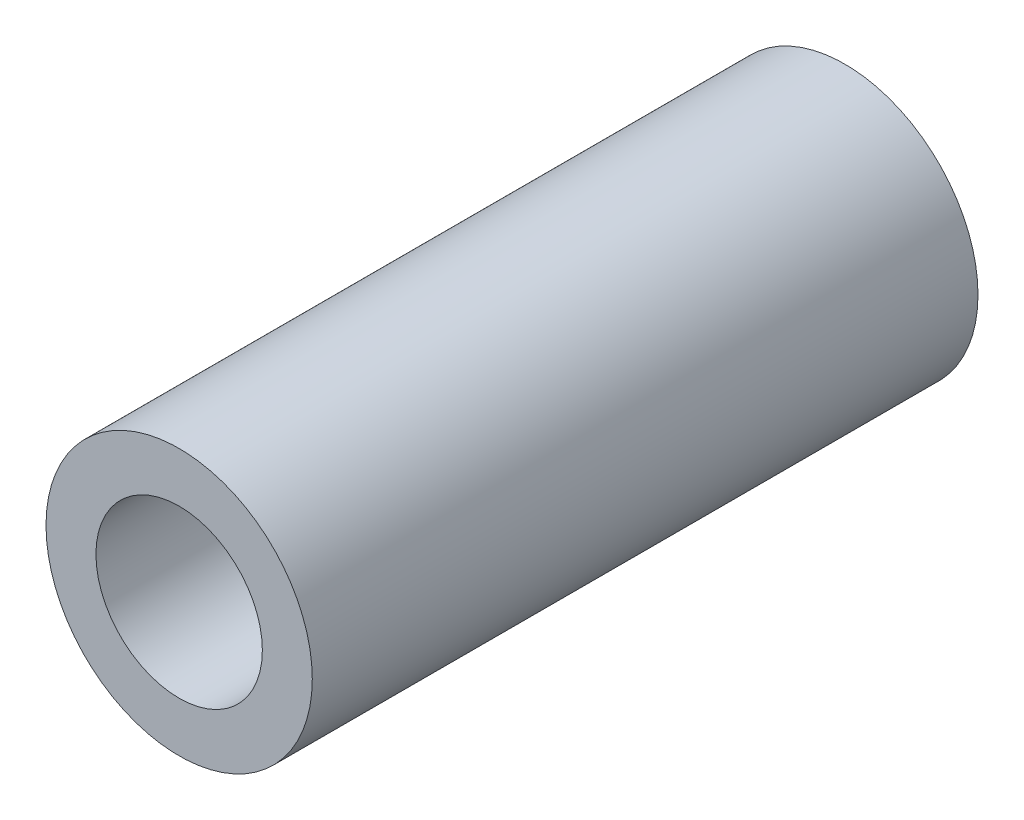
ISO-10303-21;
HEADER;
FILE_DESCRIPTION(('STEP AP214'),'2;1');
FILE_NAME('part.step','',(''),(''),'','','');
FILE_SCHEMA(('AUTOMOTIVE_DESIGN { 1 0 10303 214 1 1 1 1 }'));
ENDSEC;
DATA;
#1=APPLICATION_CONTEXT('core data for automotive mechanical design processes');
#2=APPLICATION_PROTOCOL_DEFINITION('international standard','automotive_design',2000,#1);
#3=PRODUCT_CONTEXT('',#1,'mechanical');
#4=PRODUCT('Part','Part','',(#3));
#5=PRODUCT_RELATED_PRODUCT_CATEGORY('part','',(#4));
#6=PRODUCT_DEFINITION_FORMATION('','',#4);
#7=PRODUCT_DEFINITION_CONTEXT('part definition',#1,'design');
#8=PRODUCT_DEFINITION('design','',#6,#7);
#9=PRODUCT_DEFINITION_SHAPE('','',#8);
#10=(LENGTH_UNIT() NAMED_UNIT(*) SI_UNIT(.MILLI.,.METRE.));
#11=(NAMED_UNIT(*) PLANE_ANGLE_UNIT() SI_UNIT($,.RADIAN.));
#12=(NAMED_UNIT(*) SI_UNIT($,.STERADIAN.) SOLID_ANGLE_UNIT());
#13=UNCERTAINTY_MEASURE_WITH_UNIT(LENGTH_MEASURE(1.E-05),#10,'distance_accuracy_value','');
#14=(GEOMETRIC_REPRESENTATION_CONTEXT(3) GLOBAL_UNCERTAINTY_ASSIGNED_CONTEXT((#13)) GLOBAL_UNIT_ASSIGNED_CONTEXT((#10,
#11,#12)) REPRESENTATION_CONTEXT('',''));
#15=CARTESIAN_POINT('',(0.,0.,0.));
#16=DIRECTION('',(0.,0.,1.));
#17=DIRECTION('',(1.,0.,0.));
#18=AXIS2_PLACEMENT_3D('',#15,#16,#17);
#19=CARTESIAN_POINT('',(0.,0.,20.));
#20=DIRECTION('',(0.,0.,1.));
#21=DIRECTION('',(1.,0.,0.));
#22=AXIS2_PLACEMENT_3D('',#19,#20,#21);
#23=PLANE('',#22);
#24=CARTESIAN_POINT('',(0.,0.,20.));
#25=DIRECTION('',(0.,0.,1.));
#26=DIRECTION('',(1.,0.,0.));
#27=AXIS2_PLACEMENT_3D('',#24,#25,#26);
#28=CIRCLE('',#27,4.);
#29=CARTESIAN_POINT('',(4.,0.,20.));
#30=VERTEX_POINT('',#29);
#31=EDGE_CURVE('E10',#30,#30,#28,.T.);
#32=ORIENTED_EDGE('',*,*,#31,.T.);
#33=EDGE_LOOP('',(#32));
#34=FACE_BOUND('',#33,.T.);
#35=CARTESIAN_POINT('',(0.,0.,20.));
#36=DIRECTION('',(0.,0.,1.));
#37=DIRECTION('',(1.,0.,0.));
#38=AXIS2_PLACEMENT_3D('',#35,#36,#37);
#39=CIRCLE('',#38,2.5);
#40=CARTESIAN_POINT('',(2.5,0.,20.));
#41=VERTEX_POINT('',#40);
#42=EDGE_CURVE('E41',#41,#41,#39,.T.);
#43=ORIENTED_EDGE('',*,*,#42,.F.);
#44=EDGE_LOOP('',(#43));
#45=FACE_BOUND('',#44,.T.);
#46=ADVANCED_FACE('F30',(#34,#45),#23,.T.);
#47=CARTESIAN_POINT('',(0.,0.,0.));
#48=DIRECTION('',(0.,0.,1.));
#49=DIRECTION('',(1.,0.,0.));
#50=AXIS2_PLACEMENT_3D('',#47,#48,#49);
#51=PLANE('',#50);
#52=CARTESIAN_POINT('',(0.,0.,0.));
#53=DIRECTION('',(0.,0.,1.));
#54=DIRECTION('',(1.,0.,0.));
#55=AXIS2_PLACEMENT_3D('',#52,#53,#54);
#56=CIRCLE('',#55,4.);
#57=CARTESIAN_POINT('',(4.,0.,0.));
#58=VERTEX_POINT('',#57);
#59=EDGE_CURVE('E34',#58,#58,#56,.T.);
#60=ORIENTED_EDGE('',*,*,#59,.F.);
#61=EDGE_LOOP('',(#60));
#62=FACE_BOUND('',#61,.T.);
#63=CARTESIAN_POINT('',(0.,0.,0.));
#64=DIRECTION('',(0.,0.,1.));
#65=DIRECTION('',(1.,0.,0.));
#66=AXIS2_PLACEMENT_3D('',#63,#64,#65);
#67=CIRCLE('',#66,2.5);
#68=CARTESIAN_POINT('',(2.5,0.,0.));
#69=VERTEX_POINT('',#68);
#70=EDGE_CURVE('E43',#69,#69,#67,.T.);
#71=ORIENTED_EDGE('',*,*,#70,.T.);
#72=EDGE_LOOP('',(#71));
#73=FACE_BOUND('',#72,.T.);
#74=ADVANCED_FACE('F53',(#62,#73),#51,.F.);
#75=CARTESIAN_POINT('',(0.,0.,20.));
#76=DIRECTION('',(0.,0.,-1.));
#77=DIRECTION('',(-1.,0.,0.));
#78=AXIS2_PLACEMENT_3D('',#75,#76,#77);
#79=CYLINDRICAL_SURFACE('',#78,4.);
#80=ORIENTED_EDGE('',*,*,#31,.F.);
#81=EDGE_LOOP('',(#80));
#82=FACE_BOUND('',#81,.T.);
#83=ORIENTED_EDGE('',*,*,#59,.T.);
#84=EDGE_LOOP('',(#83));
#85=FACE_BOUND('',#84,.T.);
#86=ADVANCED_FACE('F32',(#82,#85),#79,.T.);
#87=CARTESIAN_POINT('',(0.,0.,20.));
#88=DIRECTION('',(0.,0.,-1.));
#89=DIRECTION('',(-1.,0.,0.));
#90=AXIS2_PLACEMENT_3D('',#87,#88,#89);
#91=CYLINDRICAL_SURFACE('',#90,2.5);
#92=ORIENTED_EDGE('',*,*,#42,.T.);
#93=EDGE_LOOP('',(#92));
#94=FACE_BOUND('',#93,.T.);
#95=ORIENTED_EDGE('',*,*,#70,.F.);
#96=EDGE_LOOP('',(#95));
#97=FACE_BOUND('',#96,.T.);
#98=ADVANCED_FACE('F49',(#94,#97),#91,.F.);
#99=CLOSED_SHELL('',(#46,#74,#86,#98));
#100=MANIFOLD_SOLID_BREP('B2',#99);
#101=ADVANCED_BREP_SHAPE_REPRESENTATION('',(#18,#100),#14);
#102=SHAPE_DEFINITION_REPRESENTATION(#9,#101);
ENDSEC;
END-ISO-10303-21;
